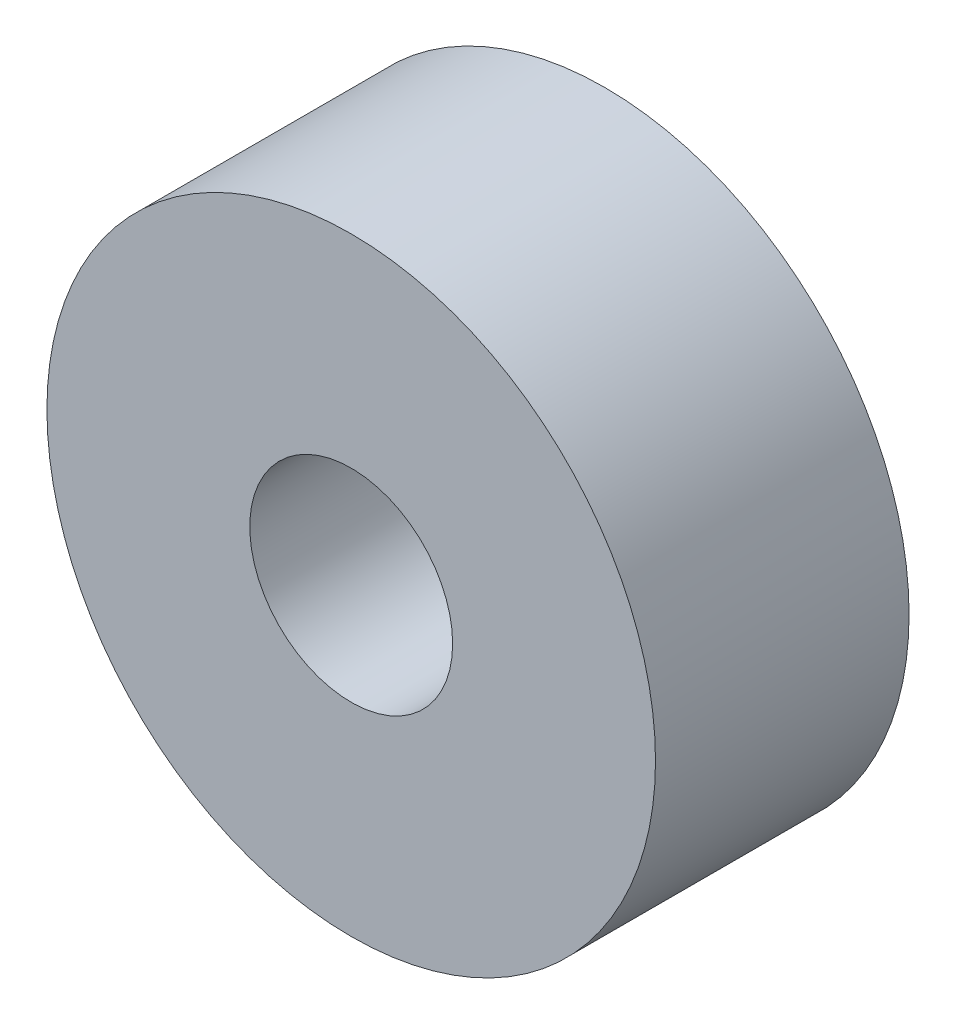
ISO-10303-21;
HEADER;
FILE_DESCRIPTION(('STEP AP214'),'2;1');
FILE_NAME('part.step','',(''),(''),'','','');
FILE_SCHEMA(('AUTOMOTIVE_DESIGN { 1 0 10303 214 1 1 1 1 }'));
ENDSEC;
DATA;
#1=APPLICATION_CONTEXT('core data for automotive mechanical design processes');
#2=APPLICATION_PROTOCOL_DEFINITION('international standard','automotive_design',2000,#1);
#3=PRODUCT_CONTEXT('',#1,'mechanical');
#4=PRODUCT('Part','Part','',(#3));
#5=PRODUCT_RELATED_PRODUCT_CATEGORY('part','',(#4));
#6=PRODUCT_DEFINITION_FORMATION('','',#4);
#7=PRODUCT_DEFINITION_CONTEXT('part definition',#1,'design');
#8=PRODUCT_DEFINITION('design','',#6,#7);
#9=PRODUCT_DEFINITION_SHAPE('','',#8);
#10=(LENGTH_UNIT() NAMED_UNIT(*) SI_UNIT(.MILLI.,.METRE.));
#11=(NAMED_UNIT(*) PLANE_ANGLE_UNIT() SI_UNIT($,.RADIAN.));
#12=(NAMED_UNIT(*) SI_UNIT($,.STERADIAN.) SOLID_ANGLE_UNIT());
#13=UNCERTAINTY_MEASURE_WITH_UNIT(LENGTH_MEASURE(1.E-05),#10,'distance_accuracy_value','');
#14=(GEOMETRIC_REPRESENTATION_CONTEXT(3) GLOBAL_UNCERTAINTY_ASSIGNED_CONTEXT((#13)) GLOBAL_UNIT_ASSIGNED_CONTEXT((#10,
#11,#12)) REPRESENTATION_CONTEXT('',''));
#15=CARTESIAN_POINT('',(0.,0.,0.));
#16=DIRECTION('',(0.,0.,1.));
#17=DIRECTION('',(1.,0.,0.));
#18=AXIS2_PLACEMENT_3D('',#15,#16,#17);
#19=CARTESIAN_POINT('',(0.,0.,5.));
#20=DIRECTION('',(0.,0.,1.));
#21=DIRECTION('',(1.,0.,0.));
#22=AXIS2_PLACEMENT_3D('',#19,#20,#21);
#23=PLANE('',#22);
#24=CARTESIAN_POINT('',(0.,0.,5.));
#25=DIRECTION('',(0.,0.,1.));
#26=DIRECTION('',(1.,0.,0.));
#27=AXIS2_PLACEMENT_3D('',#24,#25,#26);
#28=CIRCLE('',#27,6.);
#29=CARTESIAN_POINT('',(6.,0.,5.));
#30=VERTEX_POINT('',#29);
#31=EDGE_CURVE('E10',#30,#30,#28,.T.);
#32=ORIENTED_EDGE('',*,*,#31,.T.);
#33=EDGE_LOOP('',(#32));
#34=FACE_BOUND('',#33,.T.);
#35=CARTESIAN_POINT('',(0.,0.,5.));
#36=DIRECTION('',(0.,0.,1.));
#37=DIRECTION('',(1.,0.,0.));
#38=AXIS2_PLACEMENT_3D('',#35,#36,#37);
#39=CIRCLE('',#38,2.);
#40=CARTESIAN_POINT('',(2.,0.,5.));
#41=VERTEX_POINT('',#40);
#42=EDGE_CURVE('E42',#41,#41,#39,.T.);
#43=ORIENTED_EDGE('',*,*,#42,.F.);
#44=EDGE_LOOP('',(#43));
#45=FACE_BOUND('',#44,.T.);
#46=ADVANCED_FACE('F31',(#34,#45),#23,.T.);
#47=CARTESIAN_POINT('',(0.,0.,0.));
#48=DIRECTION('',(0.,0.,1.));
#49=DIRECTION('',(1.,0.,0.));
#50=AXIS2_PLACEMENT_3D('',#47,#48,#49);
#51=PLANE('',#50);
#52=CARTESIAN_POINT('',(0.,0.,0.));
#53=DIRECTION('',(0.,0.,1.));
#54=DIRECTION('',(1.,0.,0.));
#55=AXIS2_PLACEMENT_3D('',#52,#53,#54);
#56=CIRCLE('',#55,6.);
#57=CARTESIAN_POINT('',(6.,0.,0.));
#58=VERTEX_POINT('',#57);
#59=EDGE_CURVE('E35',#58,#58,#56,.T.);
#60=ORIENTED_EDGE('',*,*,#59,.F.);
#61=EDGE_LOOP('',(#60));
#62=FACE_BOUND('',#61,.T.);
#63=CARTESIAN_POINT('',(0.,0.,0.));
#64=DIRECTION('',(0.,0.,1.));
#65=DIRECTION('',(1.,0.,0.));
#66=AXIS2_PLACEMENT_3D('',#63,#64,#65);
#67=CIRCLE('',#66,2.);
#68=CARTESIAN_POINT('',(2.,0.,0.));
#69=VERTEX_POINT('',#68);
#70=EDGE_CURVE('E44',#69,#69,#67,.T.);
#71=ORIENTED_EDGE('',*,*,#70,.T.);
#72=EDGE_LOOP('',(#71));
#73=FACE_BOUND('',#72,.T.);
#74=ADVANCED_FACE('F54',(#62,#73),#51,.F.);
#75=CARTESIAN_POINT('',(0.,0.,5.));
#76=DIRECTION('',(0.,0.,-1.));
#77=DIRECTION('',(-1.,0.,0.));
#78=AXIS2_PLACEMENT_3D('',#75,#76,#77);
#79=CYLINDRICAL_SURFACE('',#78,6.);
#80=ORIENTED_EDGE('',*,*,#31,.F.);
#81=EDGE_LOOP('',(#80));
#82=FACE_BOUND('',#81,.T.);
#83=ORIENTED_EDGE('',*,*,#59,.T.);
#84=EDGE_LOOP('',(#83));
#85=FACE_BOUND('',#84,.T.);
#86=ADVANCED_FACE('F33',(#82,#85),#79,.T.);
#87=CARTESIAN_POINT('',(0.,0.,5.));
#88=DIRECTION('',(0.,0.,-1.));
#89=DIRECTION('',(-1.,0.,0.));
#90=AXIS2_PLACEMENT_3D('',#87,#88,#89);
#91=CYLINDRICAL_SURFACE('',#90,2.);
#92=ORIENTED_EDGE('',*,*,#42,.T.);
#93=EDGE_LOOP('',(#92));
#94=FACE_BOUND('',#93,.T.);
#95=ORIENTED_EDGE('',*,*,#70,.F.);
#96=EDGE_LOOP('',(#95));
#97=FACE_BOUND('',#96,.T.);
#98=ADVANCED_FACE('F50',(#94,#97),#91,.F.);
#99=CLOSED_SHELL('',(#46,#74,#86,#98));
#100=MANIFOLD_SOLID_BREP('B2',#99);
#101=ADVANCED_BREP_SHAPE_REPRESENTATION('',(#18,#100),#14);
#102=SHAPE_DEFINITION_REPRESENTATION(#9,#101);
ENDSEC;
END-ISO-10303-21;
